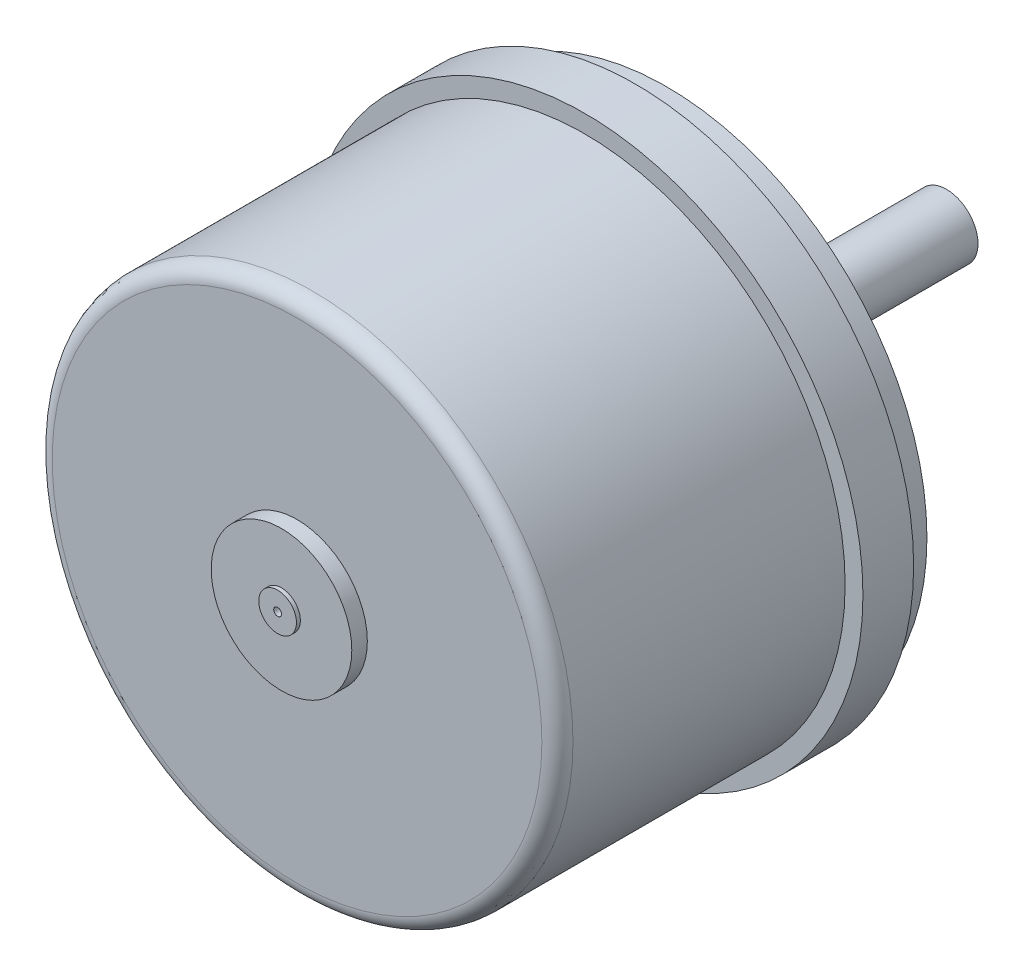
ISO-10303-21;
HEADER;
FILE_DESCRIPTION(('STEP AP214'),'2;1');
FILE_NAME('part.step','',(''),(''),'','','');
FILE_SCHEMA(('AUTOMOTIVE_DESIGN { 1 0 10303 214 1 1 1 1 }'));
ENDSEC;
DATA;
#1=APPLICATION_CONTEXT('core data for automotive mechanical design processes');
#2=APPLICATION_PROTOCOL_DEFINITION('international standard','automotive_design',2000,#1);
#3=PRODUCT_CONTEXT('',#1,'mechanical');
#4=PRODUCT('Part','Part','',(#3));
#5=PRODUCT_RELATED_PRODUCT_CATEGORY('part','',(#4));
#6=PRODUCT_DEFINITION_FORMATION('','',#4);
#7=PRODUCT_DEFINITION_CONTEXT('part definition',#1,'design');
#8=PRODUCT_DEFINITION('design','',#6,#7);
#9=PRODUCT_DEFINITION_SHAPE('','',#8);
#10=(LENGTH_UNIT() NAMED_UNIT(*) SI_UNIT(.MILLI.,.METRE.));
#11=(NAMED_UNIT(*) PLANE_ANGLE_UNIT() SI_UNIT($,.RADIAN.));
#12=(NAMED_UNIT(*) SI_UNIT($,.STERADIAN.) SOLID_ANGLE_UNIT());
#13=UNCERTAINTY_MEASURE_WITH_UNIT(LENGTH_MEASURE(1.E-05),#10,'distance_accuracy_value','');
#14=(GEOMETRIC_REPRESENTATION_CONTEXT(3) GLOBAL_UNCERTAINTY_ASSIGNED_CONTEXT((#13)) GLOBAL_UNIT_ASSIGNED_CONTEXT((#10,
#11,#12)) REPRESENTATION_CONTEXT('',''));
#15=CARTESIAN_POINT('',(0.,0.,0.));
#16=DIRECTION('',(0.,0.,1.));
#17=DIRECTION('',(1.,0.,0.));
#18=AXIS2_PLACEMENT_3D('',#15,#16,#17);
#19=CARTESIAN_POINT('',(0.,0.,2.));
#20=DIRECTION('',(0.,0.,-1.));
#21=DIRECTION('',(-1.,0.,0.));
#22=AXIS2_PLACEMENT_3D('',#19,#20,#21);
#23=CYLINDRICAL_SURFACE('',#22,33.485);
#24=CARTESIAN_POINT('',(0.,0.,2.));
#25=DIRECTION('',(0.,0.,1.));
#26=DIRECTION('',(1.,0.,0.));
#27=AXIS2_PLACEMENT_3D('',#24,#25,#26);
#28=CIRCLE('',#27,33.485);
#29=CARTESIAN_POINT('',(33.485,0.,2.));
#30=VERTEX_POINT('',#29);
#31=EDGE_CURVE('E46',#30,#30,#28,.T.);
#32=ORIENTED_EDGE('',*,*,#31,.F.);
#33=EDGE_LOOP('',(#32));
#34=FACE_BOUND('',#33,.T.);
#35=CARTESIAN_POINT('',(0.,0.,-2.));
#36=DIRECTION('',(0.,0.,1.));
#37=DIRECTION('',(1.,0.,0.));
#38=AXIS2_PLACEMENT_3D('',#35,#36,#37);
#39=CIRCLE('',#38,33.485);
#40=CARTESIAN_POINT('',(33.485,0.,-2.));
#41=VERTEX_POINT('',#40);
#42=EDGE_CURVE('E49',#41,#41,#39,.T.);
#43=ORIENTED_EDGE('',*,*,#42,.T.);
#44=EDGE_LOOP('',(#43));
#45=FACE_BOUND('',#44,.T.);
#46=ADVANCED_FACE('F31',(#34,#45),#23,.T.);
#47=CARTESIAN_POINT('',(0.,0.,-2.));
#48=DIRECTION('',(0.,0.,1.));
#49=DIRECTION('',(1.,0.,0.));
#50=AXIS2_PLACEMENT_3D('',#47,#48,#49);
#51=PLANE('',#50);
#52=CARTESIAN_POINT('',(0.,0.,-2.));
#53=DIRECTION('',(0.,0.,1.));
#54=DIRECTION('',(1.,0.,0.));
#55=AXIS2_PLACEMENT_3D('',#52,#53,#54);
#56=CIRCLE('',#55,4.05);
#57=CARTESIAN_POINT('',(4.05,0.,-2.));
#58=VERTEX_POINT('',#57);
#59=EDGE_CURVE('E42',#58,#58,#56,.F.);
#60=ORIENTED_EDGE('',*,*,#59,.F.);
#61=EDGE_LOOP('',(#60));
#62=FACE_BOUND('',#61,.T.);
#63=ORIENTED_EDGE('',*,*,#42,.F.);
#64=EDGE_LOOP('',(#63));
#65=FACE_BOUND('',#64,.T.);
#66=ADVANCED_FACE('F94',(#62,#65),#51,.F.);
#67=CARTESIAN_POINT('',(0.,0.,8.52));
#68=DIRECTION('',(0.,0.,-1.));
#69=DIRECTION('',(-1.,0.,0.));
#70=AXIS2_PLACEMENT_3D('',#67,#68,#69);
#71=CYLINDRICAL_SURFACE('',#70,35.775);
#72=CARTESIAN_POINT('',(0.,0.,8.52));
#73=DIRECTION('',(0.,0.,1.));
#74=DIRECTION('',(1.,0.,0.));
#75=AXIS2_PLACEMENT_3D('',#72,#73,#74);
#76=CIRCLE('',#75,35.775);
#77=CARTESIAN_POINT('',(35.775,0.,8.52));
#78=VERTEX_POINT('',#77);
#79=EDGE_CURVE('E52',#78,#78,#76,.T.);
#80=ORIENTED_EDGE('',*,*,#79,.F.);
#81=EDGE_LOOP('',(#80));
#82=FACE_BOUND('',#81,.T.);
#83=CARTESIAN_POINT('',(0.,0.,2.));
#84=DIRECTION('',(0.,0.,1.));
#85=DIRECTION('',(1.,0.,0.));
#86=AXIS2_PLACEMENT_3D('',#83,#84,#85);
#87=CIRCLE('',#86,35.775);
#88=CARTESIAN_POINT('',(35.775,0.,2.));
#89=VERTEX_POINT('',#88);
#90=EDGE_CURVE('E55',#89,#89,#87,.T.);
#91=ORIENTED_EDGE('',*,*,#90,.T.);
#92=EDGE_LOOP('',(#91));
#93=FACE_BOUND('',#92,.T.);
#94=ADVANCED_FACE('F97',(#82,#93),#71,.T.);
#95=CARTESIAN_POINT('',(0.,0.,8.52));
#96=DIRECTION('',(0.,0.,1.));
#97=DIRECTION('',(1.,0.,0.));
#98=AXIS2_PLACEMENT_3D('',#95,#96,#97);
#99=PLANE('',#98);
#100=CARTESIAN_POINT('',(0.,0.,8.52));
#101=DIRECTION('',(0.,0.,1.));
#102=DIRECTION('',(1.,0.,0.));
#103=AXIS2_PLACEMENT_3D('',#100,#101,#102);
#104=CIRCLE('',#103,33.485);
#105=CARTESIAN_POINT('',(33.485,0.,8.52));
#106=VERTEX_POINT('',#105);
#107=EDGE_CURVE('E58',#106,#106,#104,.T.);
#108=ORIENTED_EDGE('',*,*,#107,.F.);
#109=EDGE_LOOP('',(#108));
#110=FACE_BOUND('',#109,.T.);
#111=ORIENTED_EDGE('',*,*,#79,.T.);
#112=EDGE_LOOP('',(#111));
#113=FACE_BOUND('',#112,.T.);
#114=ADVANCED_FACE('F109',(#110,#113),#99,.T.);
#115=CARTESIAN_POINT('',(0.,0.,2.));
#116=DIRECTION('',(0.,0.,1.));
#117=DIRECTION('',(1.,0.,0.));
#118=AXIS2_PLACEMENT_3D('',#115,#116,#117);
#119=PLANE('',#118);
#120=ORIENTED_EDGE('',*,*,#31,.T.);
#121=EDGE_LOOP('',(#120));
#122=FACE_BOUND('',#121,.T.);
#123=ORIENTED_EDGE('',*,*,#90,.F.);
#124=EDGE_LOOP('',(#123));
#125=FACE_BOUND('',#124,.T.);
#126=ADVANCED_FACE('F111',(#122,#125),#119,.F.);
#127=CARTESIAN_POINT('',(0.,0.,45.52));
#128=DIRECTION('',(0.,0.,-1.));
#129=DIRECTION('',(-1.,0.,0.));
#130=AXIS2_PLACEMENT_3D('',#127,#128,#129);
#131=CYLINDRICAL_SURFACE('',#130,33.485);
#132=CARTESIAN_POINT('',(0.,0.,43.52));
#133=DIRECTION('',(0.,0.,1.));
#134=DIRECTION('',(1.,0.,0.));
#135=AXIS2_PLACEMENT_3D('',#132,#133,#134);
#136=CIRCLE('',#135,33.485);
#137=CARTESIAN_POINT('',(33.485,0.,43.52));
#138=VERTEX_POINT('',#137);
#139=EDGE_CURVE('E10',#138,#138,#136,.F.);
#140=ORIENTED_EDGE('',*,*,#139,.T.);
#141=EDGE_LOOP('',(#140));
#142=FACE_BOUND('',#141,.T.);
#143=ORIENTED_EDGE('',*,*,#107,.T.);
#144=EDGE_LOOP('',(#143));
#145=FACE_BOUND('',#144,.T.);
#146=ADVANCED_FACE('F114',(#142,#145),#131,.T.);
#147=CARTESIAN_POINT('',(0.,0.,45.52));
#148=DIRECTION('',(0.,0.,1.));
#149=DIRECTION('',(1.,0.,0.));
#150=AXIS2_PLACEMENT_3D('',#147,#148,#149);
#151=PLANE('',#150);
#152=CARTESIAN_POINT('',(0.,0.,45.52));
#153=DIRECTION('',(0.,0.,1.));
#154=DIRECTION('',(1.,0.,0.));
#155=AXIS2_PLACEMENT_3D('',#152,#153,#154);
#156=CIRCLE('',#155,31.485);
#157=CARTESIAN_POINT('',(31.485,0.,45.52));
#158=VERTEX_POINT('',#157);
#159=EDGE_CURVE('E38',#158,#158,#156,.T.);
#160=ORIENTED_EDGE('',*,*,#159,.T.);
#161=EDGE_LOOP('',(#160));
#162=FACE_BOUND('',#161,.T.);
#163=CARTESIAN_POINT('',(0.,0.,45.52));
#164=DIRECTION('',(0.,0.,1.));
#165=DIRECTION('',(1.,0.,0.));
#166=AXIS2_PLACEMENT_3D('',#163,#164,#165);
#167=CIRCLE('',#166,9.04);
#168=CARTESIAN_POINT('',(9.04,0.,45.52));
#169=VERTEX_POINT('',#168);
#170=EDGE_CURVE('E64',#169,#169,#167,.T.);
#171=ORIENTED_EDGE('',*,*,#170,.F.);
#172=EDGE_LOOP('',(#171));
#173=FACE_BOUND('',#172,.T.);
#174=ADVANCED_FACE('F121',(#162,#173),#151,.T.);
#175=CARTESIAN_POINT('',(0.,0.,47.52));
#176=DIRECTION('',(0.,0.,-1.));
#177=DIRECTION('',(-1.,0.,0.));
#178=AXIS2_PLACEMENT_3D('',#175,#176,#177);
#179=CYLINDRICAL_SURFACE('',#178,9.04);
#180=CARTESIAN_POINT('',(0.,0.,47.52));
#181=DIRECTION('',(0.,0.,1.));
#182=DIRECTION('',(1.,0.,0.));
#183=AXIS2_PLACEMENT_3D('',#180,#181,#182);
#184=CIRCLE('',#183,9.04);
#185=CARTESIAN_POINT('',(9.04,0.,47.52));
#186=VERTEX_POINT('',#185);
#187=EDGE_CURVE('E63',#186,#186,#184,.T.);
#188=ORIENTED_EDGE('',*,*,#187,.F.);
#189=EDGE_LOOP('',(#188));
#190=FACE_BOUND('',#189,.T.);
#191=ORIENTED_EDGE('',*,*,#170,.T.);
#192=EDGE_LOOP('',(#191));
#193=FACE_BOUND('',#192,.T.);
#194=ADVANCED_FACE('F124',(#190,#193),#179,.T.);
#195=CARTESIAN_POINT('',(0.,0.,47.52));
#196=DIRECTION('',(0.,0.,1.));
#197=DIRECTION('',(1.,0.,0.));
#198=AXIS2_PLACEMENT_3D('',#195,#196,#197);
#199=PLANE('',#198);
#200=CARTESIAN_POINT('',(0.,0.,47.52));
#201=DIRECTION('',(0.,0.,1.));
#202=DIRECTION('',(1.,0.,0.));
#203=AXIS2_PLACEMENT_3D('',#200,#201,#202);
#204=CIRCLE('',#203,2.425);
#205=CARTESIAN_POINT('',(2.425,0.,47.52));
#206=VERTEX_POINT('',#205);
#207=EDGE_CURVE('E70',#206,#206,#204,.T.);
#208=ORIENTED_EDGE('',*,*,#207,.F.);
#209=EDGE_LOOP('',(#208));
#210=FACE_BOUND('',#209,.T.);
#211=ORIENTED_EDGE('',*,*,#187,.T.);
#212=EDGE_LOOP('',(#211));
#213=FACE_BOUND('',#212,.T.);
#214=ADVANCED_FACE('F127',(#210,#213),#199,.T.);
#215=CARTESIAN_POINT('',(0.,0.,48.02));
#216=DIRECTION('',(0.,0.,-1.));
#217=DIRECTION('',(-1.,0.,0.));
#218=AXIS2_PLACEMENT_3D('',#215,#216,#217);
#219=CYLINDRICAL_SURFACE('',#218,2.425);
#220=CARTESIAN_POINT('',(0.,0.,48.02));
#221=DIRECTION('',(0.,0.,1.));
#222=DIRECTION('',(1.,0.,0.));
#223=AXIS2_PLACEMENT_3D('',#220,#221,#222);
#224=CIRCLE('',#223,2.425);
#225=CARTESIAN_POINT('',(2.425,0.,48.02));
#226=VERTEX_POINT('',#225);
#227=EDGE_CURVE('E67',#226,#226,#224,.T.);
#228=ORIENTED_EDGE('',*,*,#227,.F.);
#229=EDGE_LOOP('',(#228));
#230=FACE_BOUND('',#229,.T.);
#231=ORIENTED_EDGE('',*,*,#207,.T.);
#232=EDGE_LOOP('',(#231));
#233=FACE_BOUND('',#232,.T.);
#234=ADVANCED_FACE('F131',(#230,#233),#219,.T.);
#235=CARTESIAN_POINT('',(0.,0.,48.02));
#236=DIRECTION('',(0.,0.,1.));
#237=DIRECTION('',(1.,0.,0.));
#238=AXIS2_PLACEMENT_3D('',#235,#236,#237);
#239=PLANE('',#238);
#240=CARTESIAN_POINT('',(0.,0.,48.02));
#241=DIRECTION('',(0.,0.,1.));
#242=DIRECTION('',(1.,0.,0.));
#243=AXIS2_PLACEMENT_3D('',#240,#241,#242);
#244=CIRCLE('',#243,0.5);
#245=CARTESIAN_POINT('',(0.5,0.,48.02));
#246=VERTEX_POINT('',#245);
#247=EDGE_CURVE('E76',#246,#246,#244,.T.);
#248=ORIENTED_EDGE('',*,*,#247,.F.);
#249=EDGE_LOOP('',(#248));
#250=FACE_BOUND('',#249,.T.);
#251=ORIENTED_EDGE('',*,*,#227,.T.);
#252=EDGE_LOOP('',(#251));
#253=FACE_BOUND('',#252,.T.);
#254=ADVANCED_FACE('F135',(#250,#253),#239,.T.);
#255=CARTESIAN_POINT('',(0.,0.,47.02));
#256=DIRECTION('',(0.,0.,1.));
#257=DIRECTION('',(1.,0.,0.));
#258=AXIS2_PLACEMENT_3D('',#255,#256,#257);
#259=CYLINDRICAL_SURFACE('',#258,0.5);
#260=CARTESIAN_POINT('',(0.,0.,47.02));
#261=DIRECTION('',(0.,0.,1.));
#262=DIRECTION('',(1.,0.,0.));
#263=AXIS2_PLACEMENT_3D('',#260,#261,#262);
#264=CIRCLE('',#263,0.5);
#265=CARTESIAN_POINT('',(0.5,0.,47.02));
#266=VERTEX_POINT('',#265);
#267=EDGE_CURVE('E73',#266,#266,#264,.T.);
#268=ORIENTED_EDGE('',*,*,#267,.F.);
#269=EDGE_LOOP('',(#268));
#270=FACE_BOUND('',#269,.T.);
#271=ORIENTED_EDGE('',*,*,#247,.T.);
#272=EDGE_LOOP('',(#271));
#273=FACE_BOUND('',#272,.T.);
#274=ADVANCED_FACE('F139',(#270,#273),#259,.F.);
#275=CARTESIAN_POINT('',(0.,0.,47.02));
#276=DIRECTION('',(0.,0.,1.));
#277=DIRECTION('',(1.,0.,0.));
#278=AXIS2_PLACEMENT_3D('',#275,#276,#277);
#279=PLANE('',#278);
#280=ORIENTED_EDGE('',*,*,#267,.T.);
#281=EDGE_LOOP('',(#280));
#282=FACE_BOUND('',#281,.T.);
#283=ADVANCED_FACE('F90',(#282),#279,.T.);
#284=CARTESIAN_POINT('',(0.,0.,-38.));
#285=DIRECTION('',(0.,0.,1.));
#286=DIRECTION('',(1.,0.,0.));
#287=AXIS2_PLACEMENT_3D('',#284,#285,#286);
#288=CYLINDRICAL_SURFACE('',#287,4.05);
#289=CARTESIAN_POINT('',(0.,0.,-38.));
#290=DIRECTION('',(0.,0.,-1.));
#291=DIRECTION('',(-1.,0.,0.));
#292=AXIS2_PLACEMENT_3D('',#289,#290,#291);
#293=CIRCLE('',#292,4.05);
#294=CARTESIAN_POINT('',(-4.05,0.,-38.));
#295=VERTEX_POINT('',#294);
#296=EDGE_CURVE('E79',#295,#295,#293,.T.);
#297=ORIENTED_EDGE('',*,*,#296,.F.);
#298=EDGE_LOOP('',(#297));
#299=FACE_BOUND('',#298,.T.);
#300=ORIENTED_EDGE('',*,*,#59,.T.);
#301=EDGE_LOOP('',(#300));
#302=FACE_BOUND('',#301,.T.);
#303=ADVANCED_FACE('F87',(#299,#302),#288,.T.);
#304=CARTESIAN_POINT('',(0.,0.,-38.));
#305=DIRECTION('',(0.,0.,-1.));
#306=DIRECTION('',(-1.,0.,0.));
#307=AXIS2_PLACEMENT_3D('',#304,#305,#306);
#308=PLANE('',#307);
#309=ORIENTED_EDGE('',*,*,#296,.T.);
#310=EDGE_LOOP('',(#309));
#311=FACE_BOUND('',#310,.T.);
#312=ADVANCED_FACE('F85',(#311),#308,.T.);
#313=CARTESIAN_POINT('',(0.,0.,43.52));
#314=DIRECTION('',(0.,0.,1.));
#315=DIRECTION('',(1.,0.,0.));
#316=AXIS2_PLACEMENT_3D('',#313,#314,#315);
#317=TOROIDAL_SURFACE('',#316,31.485,2.);
#318=ORIENTED_EDGE('',*,*,#139,.F.);
#319=EDGE_LOOP('',(#318));
#320=FACE_BOUND('',#319,.T.);
#321=ORIENTED_EDGE('',*,*,#159,.F.);
#322=EDGE_LOOP('',(#321));
#323=FACE_BOUND('',#322,.T.);
#324=ADVANCED_FACE('F33',(#320,#323),#317,.T.);
#325=CLOSED_SHELL('',(#46,#66,#94,#114,#126,#146,#174,#194,#214,#234,#254,#274,#283,#303,#312,#324));
#326=MANIFOLD_SOLID_BREP('B2',#325);
#327=ADVANCED_BREP_SHAPE_REPRESENTATION('',(#18,#326),#14);
#328=SHAPE_DEFINITION_REPRESENTATION(#9,#327);
ENDSEC;
END-ISO-10303-21;
